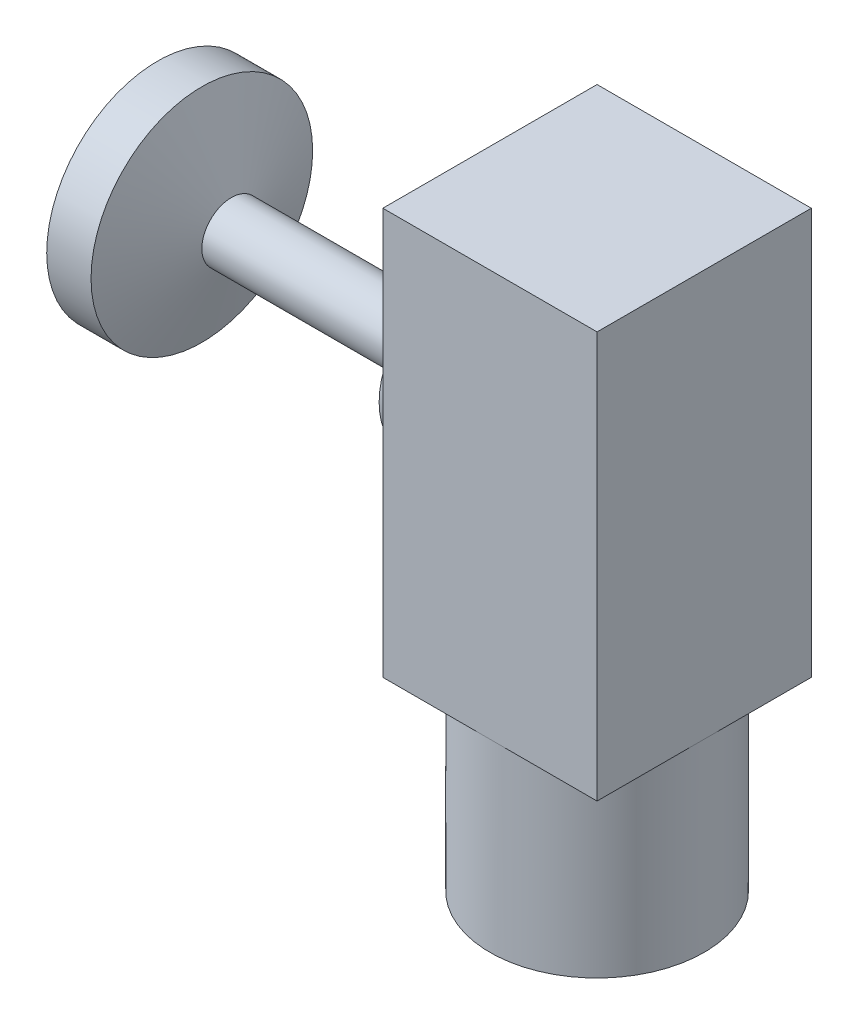
ISO-10303-21;
HEADER;
FILE_DESCRIPTION(('STEP AP214'),'2;1');
FILE_NAME('part.step','',(''),(''),'','','');
FILE_SCHEMA(('AUTOMOTIVE_DESIGN { 1 0 10303 214 1 1 1 1 }'));
ENDSEC;
DATA;
#1=APPLICATION_CONTEXT('core data for automotive mechanical design processes');
#2=APPLICATION_PROTOCOL_DEFINITION('international standard','automotive_design',2000,#1);
#3=PRODUCT_CONTEXT('',#1,'mechanical');
#4=PRODUCT('Part','Part','',(#3));
#5=PRODUCT_RELATED_PRODUCT_CATEGORY('part','',(#4));
#6=PRODUCT_DEFINITION_FORMATION('','',#4);
#7=PRODUCT_DEFINITION_CONTEXT('part definition',#1,'design');
#8=PRODUCT_DEFINITION('design','',#6,#7);
#9=PRODUCT_DEFINITION_SHAPE('','',#8);
#10=(LENGTH_UNIT() NAMED_UNIT(*) SI_UNIT(.MILLI.,.METRE.));
#11=(NAMED_UNIT(*) PLANE_ANGLE_UNIT() SI_UNIT($,.RADIAN.));
#12=(NAMED_UNIT(*) SI_UNIT($,.STERADIAN.) SOLID_ANGLE_UNIT());
#13=UNCERTAINTY_MEASURE_WITH_UNIT(LENGTH_MEASURE(1.E-05),#10,'distance_accuracy_value','');
#14=(GEOMETRIC_REPRESENTATION_CONTEXT(3) GLOBAL_UNCERTAINTY_ASSIGNED_CONTEXT((#13)) GLOBAL_UNIT_ASSIGNED_CONTEXT((#10,
#11,#12)) REPRESENTATION_CONTEXT('',''));
#15=CARTESIAN_POINT('',(0.,0.,0.));
#16=DIRECTION('',(0.,0.,1.));
#17=DIRECTION('',(1.,0.,0.));
#18=AXIS2_PLACEMENT_3D('',#15,#16,#17);
#19=CARTESIAN_POINT('',(64.,-27.5,14.5));
#20=DIRECTION('',(0.,1.,0.));
#21=DIRECTION('',(0.,0.,1.));
#22=AXIS2_PLACEMENT_3D('',#19,#20,#21);
#23=PLANE('',#22);
#24=CARTESIAN_POINT('',(49.5,-27.5,0.));
#25=DIRECTION('',(0.,-1.,0.));
#26=DIRECTION('',(0.,0.,-1.));
#27=AXIS2_PLACEMENT_3D('',#24,#25,#26);
#28=CIRCLE('',#27,14.5);
#29=CARTESIAN_POINT('',(49.5,-27.5,-14.5));
#30=VERTEX_POINT('',#29);
#31=CARTESIAN_POINT('',(64.,-27.5,0.));
#32=VERTEX_POINT('',#31);
#33=EDGE_CURVE('E52',#30,#32,#28,.T.);
#34=ORIENTED_EDGE('',*,*,#33,.F.);
#35=DIRECTION('',(-1.,0.,0.));
#36=VECTOR('',#35,1.);
#37=CARTESIAN_POINT('',(64.,-27.5,-14.5));
#38=LINE('',#37,#36);
#39=CARTESIAN_POINT('',(64.,-27.5,-14.5));
#40=VERTEX_POINT('',#39);
#41=EDGE_CURVE('E97',#40,#30,#38,.T.);
#42=ORIENTED_EDGE('',*,*,#41,.F.);
#43=DIRECTION('',(0.,0.,-1.));
#44=VECTOR('',#43,1.);
#45=CARTESIAN_POINT('',(64.,-27.5,14.5));
#46=LINE('',#45,#44);
#47=EDGE_CURVE('E119',#32,#40,#46,.T.);
#48=ORIENTED_EDGE('',*,*,#47,.F.);
#49=EDGE_LOOP('',(#34,#42,#48));
#50=FACE_BOUND('',#49,.T.);
#51=ADVANCED_FACE('F41',(#50),#23,.F.);
#52=CARTESIAN_POINT('',(49.5,-27.5,14.5));
#53=VERTEX_POINT('',#52);
#54=EDGE_CURVE('E11',#32,#53,#28,.T.);
#55=ORIENTED_EDGE('',*,*,#54,.F.);
#56=CARTESIAN_POINT('',(64.,-27.5,14.5));
#57=VERTEX_POINT('',#56);
#58=EDGE_CURVE('E117',#57,#32,#46,.T.);
#59=ORIENTED_EDGE('',*,*,#58,.F.);
#60=DIRECTION('',(-1.,0.,0.));
#61=VECTOR('',#60,1.);
#62=CARTESIAN_POINT('',(64.,-27.5,14.5));
#63=LINE('',#62,#61);
#64=EDGE_CURVE('E143',#57,#53,#63,.T.);
#65=ORIENTED_EDGE('',*,*,#64,.T.);
#66=EDGE_LOOP('',(#55,#59,#65));
#67=FACE_BOUND('',#66,.T.);
#68=ADVANCED_FACE('F203',(#67),#23,.F.);
#69=CARTESIAN_POINT('',(35.,-27.5,0.));
#70=VERTEX_POINT('',#69);
#71=EDGE_CURVE('E50',#53,#70,#28,.T.);
#72=ORIENTED_EDGE('',*,*,#71,.F.);
#73=CARTESIAN_POINT('',(35.,-27.5,14.5));
#74=VERTEX_POINT('',#73);
#75=EDGE_CURVE('E108',#53,#74,#63,.T.);
#76=ORIENTED_EDGE('',*,*,#75,.T.);
#77=DIRECTION('',(0.,0.,-1.));
#78=VECTOR('',#77,1.);
#79=CARTESIAN_POINT('',(35.,-27.5,14.5));
#80=LINE('',#79,#78);
#81=EDGE_CURVE('E130',#74,#70,#80,.T.);
#82=ORIENTED_EDGE('',*,*,#81,.T.);
#83=EDGE_LOOP('',(#72,#76,#82));
#84=FACE_BOUND('',#83,.T.);
#85=ADVANCED_FACE('F174',(#84),#23,.F.);
#86=CARTESIAN_POINT('',(-10.,0.,0.));
#87=DIRECTION('',(-1.,0.,0.));
#88=DIRECTION('',(0.,0.,1.));
#89=AXIS2_PLACEMENT_3D('',#86,#87,#88);
#90=CYLINDRICAL_SURFACE('',#89,4.);
#91=CARTESIAN_POINT('',(0.,0.,0.));
#92=DIRECTION('',(-1.,0.,0.));
#93=DIRECTION('',(0.,0.,1.));
#94=AXIS2_PLACEMENT_3D('',#91,#92,#93);
#95=CIRCLE('',#94,4.);
#96=CARTESIAN_POINT('',(0.,0.,4.));
#97=VERTEX_POINT('',#96);
#98=EDGE_CURVE('E45',#97,#97,#95,.T.);
#99=ORIENTED_EDGE('',*,*,#98,.F.);
#100=EDGE_LOOP('',(#99));
#101=FACE_BOUND('',#100,.T.);
#102=CARTESIAN_POINT('',(30.,0.,0.));
#103=DIRECTION('',(-1.,0.,0.));
#104=DIRECTION('',(0.,0.,1.));
#105=AXIS2_PLACEMENT_3D('',#102,#103,#104);
#106=CIRCLE('',#105,4.);
#107=CARTESIAN_POINT('',(30.,0.,4.));
#108=VERTEX_POINT('',#107);
#109=EDGE_CURVE('E152',#108,#108,#106,.T.);
#110=ORIENTED_EDGE('',*,*,#109,.T.);
#111=EDGE_LOOP('',(#110));
#112=FACE_BOUND('',#111,.T.);
#113=ADVANCED_FACE('F43',(#101,#112),#90,.T.);
#114=CARTESIAN_POINT('',(0.,0.,0.));
#115=DIRECTION('',(-1.,0.,0.));
#116=DIRECTION('',(0.,0.,1.));
#117=AXIS2_PLACEMENT_3D('',#114,#115,#116);
#118=CONICAL_SURFACE('',#117,4.,1.22202532321099);
#119=CARTESIAN_POINT('',(-4.,0.,0.));
#120=DIRECTION('',(-1.,0.,0.));
#121=DIRECTION('',(0.,0.,1.));
#122=AXIS2_PLACEMENT_3D('',#119,#120,#121);
#123=CIRCLE('',#122,15.);
#124=CARTESIAN_POINT('',(-4.,0.,15.));
#125=VERTEX_POINT('',#124);
#126=EDGE_CURVE('E125',#125,#125,#123,.T.);
#127=CARTESIAN_POINT('',(-4.,0.,15.));
#128=CARTESIAN_POINT('',(-3.95833333333334,0.,14.8854166666667));
#129=CARTESIAN_POINT('',(-3.91666666666667,0.,14.7708333333333));
#130=CARTESIAN_POINT('',(-3.83333333333333,0.,14.5416666666667));
#131=CARTESIAN_POINT('',(-3.79166666666667,0.,14.4270833333333));
#132=CARTESIAN_POINT('',(-3.70833333333333,0.,14.1979166666667));
#133=CARTESIAN_POINT('',(-3.66666666666667,0.,14.0833333333333));
#134=CARTESIAN_POINT('',(-3.58333333333334,0.,13.8541666666667));
#135=CARTESIAN_POINT('',(-3.54166666666667,0.,13.7395833333333));
#136=CARTESIAN_POINT('',(-3.45833333333333,0.,13.5104166666667));
#137=CARTESIAN_POINT('',(-3.41666666666667,0.,13.3958333333333));
#138=CARTESIAN_POINT('',(-3.33333333333333,0.,13.1666666666667));
#139=CARTESIAN_POINT('',(-3.29166666666667,0.,13.0520833333333));
#140=CARTESIAN_POINT('',(-3.20833333333334,0.,12.8229166666667));
#141=CARTESIAN_POINT('',(-3.16666666666667,0.,12.7083333333333));
#142=CARTESIAN_POINT('',(-3.08333333333333,0.,12.4791666666667));
#143=CARTESIAN_POINT('',(-3.04166666666667,0.,12.3645833333333));
#144=CARTESIAN_POINT('',(-2.95833333333333,0.,12.1354166666667));
#145=CARTESIAN_POINT('',(-2.91666666666667,0.,12.0208333333333));
#146=CARTESIAN_POINT('',(-2.83333333333333,0.,11.7916666666667));
#147=CARTESIAN_POINT('',(-2.79166666666667,0.,11.6770833333333));
#148=CARTESIAN_POINT('',(-2.70833333333333,0.,11.4479166666667));
#149=CARTESIAN_POINT('',(-2.66666666666667,0.,11.3333333333333));
#150=CARTESIAN_POINT('',(-2.58333333333334,0.,11.1041666666667));
#151=CARTESIAN_POINT('',(-2.54166666666667,0.,10.9895833333333));
#152=CARTESIAN_POINT('',(-2.45833333333333,0.,10.7604166666667));
#153=CARTESIAN_POINT('',(-2.41666666666667,0.,10.6458333333333));
#154=CARTESIAN_POINT('',(-2.33333333333333,0.,10.4166666666667));
#155=CARTESIAN_POINT('',(-2.29166666666667,0.,10.3020833333333));
#156=CARTESIAN_POINT('',(-2.20833333333333,0.,10.0729166666667));
#157=CARTESIAN_POINT('',(-2.16666666666667,0.,9.95833333333333));
#158=CARTESIAN_POINT('',(-2.08333333333333,0.,9.72916666666667));
#159=CARTESIAN_POINT('',(-2.04166666666667,0.,9.61458333333333));
#160=CARTESIAN_POINT('',(-1.95833333333333,0.,9.38541666666667));
#161=CARTESIAN_POINT('',(-1.91666666666667,0.,9.27083333333333));
#162=CARTESIAN_POINT('',(-1.83333333333333,0.,9.04166666666667));
#163=CARTESIAN_POINT('',(-1.79166666666667,0.,8.92708333333333));
#164=CARTESIAN_POINT('',(-1.70833333333333,0.,8.69791666666667));
#165=CARTESIAN_POINT('',(-1.66666666666667,0.,8.58333333333333));
#166=CARTESIAN_POINT('',(-1.58333333333333,0.,8.35416666666667));
#167=CARTESIAN_POINT('',(-1.54166666666667,0.,8.23958333333333));
#168=CARTESIAN_POINT('',(-1.45833333333333,0.,8.01041666666667));
#169=CARTESIAN_POINT('',(-1.41666666666667,0.,7.89583333333333));
#170=CARTESIAN_POINT('',(-1.33333333333333,0.,7.66666666666667));
#171=CARTESIAN_POINT('',(-1.29166666666667,0.,7.55208333333333));
#172=CARTESIAN_POINT('',(-1.20833333333333,0.,7.32291666666667));
#173=CARTESIAN_POINT('',(-1.16666666666667,0.,7.20833333333333));
#174=CARTESIAN_POINT('',(-1.08333333333333,0.,6.97916666666667));
#175=CARTESIAN_POINT('',(-1.04166666666667,0.,6.86458333333333));
#176=CARTESIAN_POINT('',(-0.958333333333334,0.,6.63541666666667));
#177=CARTESIAN_POINT('',(-0.916666666666667,0.,6.52083333333333));
#178=CARTESIAN_POINT('',(-0.833333333333334,0.,6.29166666666667));
#179=CARTESIAN_POINT('',(-0.791666666666667,0.,6.17708333333333));
#180=CARTESIAN_POINT('',(-0.708333333333333,0.,5.94791666666667));
#181=CARTESIAN_POINT('',(-0.666666666666667,0.,5.83333333333333));
#182=CARTESIAN_POINT('',(-0.583333333333334,0.,5.60416666666667));
#183=CARTESIAN_POINT('',(-0.541666666666667,0.,5.48958333333333));
#184=CARTESIAN_POINT('',(-0.458333333333334,0.,5.26041666666667));
#185=CARTESIAN_POINT('',(-0.416666666666667,0.,5.14583333333333));
#186=CARTESIAN_POINT('',(-0.333333333333334,0.,4.91666666666667));
#187=CARTESIAN_POINT('',(-0.291666666666667,0.,4.80208333333333));
#188=CARTESIAN_POINT('',(-0.208333333333334,0.,4.57291666666667));
#189=CARTESIAN_POINT('',(-0.166666666666667,0.,4.45833333333333));
#190=CARTESIAN_POINT('',(-0.0833333333333334,0.,4.22916666666667));
#191=CARTESIAN_POINT('',(-0.0416666666666667,0.,4.11458333333333));
#192=CARTESIAN_POINT('',(0.,0.,4.));
#193=B_SPLINE_CURVE_WITH_KNOTS('',3,(#127,#128,#129,#130,#131,#132,#133,#134,#135,#136,#137,
#138,#139,#140,#141,#142,#143,#144,#145,#146,#147,#148,#149,#150,#151,#152,#153,#154,#155,#156,
#157,#158,#159,#160,#161,#162,#163,#164,#165,#166,#167,#168,#169,#170,#171,#172,#173,#174,#175,
#176,#177,#178,#179,#180,#181,#182,#183,#184,#185,#186,#187,#188,#189,#190,#191,#192),
.UNSPECIFIED.,.F.,.F.,(4,2,2,2,2,2,2,2,2,2,2,2,2,2,2,2,2,2,2,2,2,2,2,2,2,2,2,2,2,2,2,2,4),(0.,
0.365771872209989,0.731543744419977,1.09731561662997,1.46308748883995,1.82885936104994,
2.19463123325993,2.56040310546992,2.92617497767991,3.29194684988989,3.65771872209988,
4.02349059430987,4.38926246651986,4.75503433872985,5.12080621093984,5.48657808314982,
5.85234995535981,6.2181218275698,6.58389369977979,6.94966557198978,7.31543744419976,
7.68120931640975,8.04698118861974,8.41275306082973,8.77852493303972,9.14429680524971,
9.51006867745969,9.87584054966968,10.2416124218797,10.6073842940897,10.9731561662996,
11.3389280385096,11.7046999107196),.UNSPECIFIED.);
#194=EDGE_CURVE('BSEAM167',#125,#97,#193,.T.);
#195=ORIENTED_EDGE('',*,*,#126,.F.);
#196=ORIENTED_EDGE('',*,*,#98,.T.);
#197=ORIENTED_EDGE('',*,*,#194,.T.);
#198=ORIENTED_EDGE('',*,*,#194,.F.);
#199=EDGE_LOOP('',(#195,#197,#196,#198));
#200=FACE_BOUND('',#199,.T.);
#201=ADVANCED_FACE('F167',(#200),#118,.T.);
#202=CARTESIAN_POINT('',(-10.,0.,0.));
#203=DIRECTION('',(-1.,0.,0.));
#204=DIRECTION('',(0.,0.,1.));
#205=AXIS2_PLACEMENT_3D('',#202,#203,#204);
#206=CYLINDRICAL_SURFACE('',#205,15.);
#207=CARTESIAN_POINT('',(-10.,0.,0.));
#208=DIRECTION('',(-1.,0.,0.));
#209=DIRECTION('',(0.,0.,1.));
#210=AXIS2_PLACEMENT_3D('',#207,#208,#209);
#211=CIRCLE('',#210,15.);
#212=CARTESIAN_POINT('',(-10.,0.,15.));
#213=VERTEX_POINT('',#212);
#214=EDGE_CURVE('E158',#213,#213,#211,.T.);
#215=ORIENTED_EDGE('',*,*,#214,.F.);
#216=EDGE_LOOP('',(#215));
#217=FACE_BOUND('',#216,.T.);
#218=ORIENTED_EDGE('',*,*,#126,.T.);
#219=EDGE_LOOP('',(#218));
#220=FACE_BOUND('',#219,.T.);
#221=ADVANCED_FACE('F165',(#217,#220),#206,.T.);
#222=CARTESIAN_POINT('',(-10.,15.,0.));
#223=DIRECTION('',(1.,0.,0.));
#224=DIRECTION('',(0.,0.,-1.));
#225=AXIS2_PLACEMENT_3D('',#222,#223,#224);
#226=PLANE('',#225);
#227=ORIENTED_EDGE('',*,*,#214,.T.);
#228=EDGE_LOOP('',(#227));
#229=FACE_BOUND('',#228,.T.);
#230=ADVANCED_FACE('F186',(#229),#226,.F.);
#231=CARTESIAN_POINT('',(-10.,0.,0.));
#232=DIRECTION('',(-1.,0.,0.));
#233=DIRECTION('',(0.,0.,1.));
#234=AXIS2_PLACEMENT_3D('',#231,#232,#233);
#235=CYLINDRICAL_SURFACE('',#234,10.);
#236=CARTESIAN_POINT('',(30.,0.,0.));
#237=DIRECTION('',(-1.,0.,0.));
#238=DIRECTION('',(0.,0.,1.));
#239=AXIS2_PLACEMENT_3D('',#236,#237,#238);
#240=CIRCLE('',#239,10.);
#241=CARTESIAN_POINT('',(30.,0.,10.));
#242=VERTEX_POINT('',#241);
#243=EDGE_CURVE('E155',#242,#242,#240,.T.);
#244=ORIENTED_EDGE('',*,*,#243,.F.);
#245=EDGE_LOOP('',(#244));
#246=FACE_BOUND('',#245,.T.);
#247=CARTESIAN_POINT('',(35.,0.,0.));
#248=DIRECTION('',(-1.,0.,0.));
#249=DIRECTION('',(0.,0.,1.));
#250=AXIS2_PLACEMENT_3D('',#247,#248,#249);
#251=CIRCLE('',#250,10.);
#252=CARTESIAN_POINT('',(35.,0.,10.));
#253=VERTEX_POINT('',#252);
#254=EDGE_CURVE('E151',#253,#253,#251,.T.);
#255=ORIENTED_EDGE('',*,*,#254,.T.);
#256=EDGE_LOOP('',(#255));
#257=FACE_BOUND('',#256,.T.);
#258=ADVANCED_FACE('F180',(#246,#257),#235,.T.);
#259=CARTESIAN_POINT('',(30.,4.,0.));
#260=DIRECTION('',(1.,0.,0.));
#261=DIRECTION('',(0.,0.,-1.));
#262=AXIS2_PLACEMENT_3D('',#259,#260,#261);
#263=PLANE('',#262);
#264=ORIENTED_EDGE('',*,*,#109,.F.);
#265=EDGE_LOOP('',(#264));
#266=FACE_BOUND('',#265,.T.);
#267=ORIENTED_EDGE('',*,*,#243,.T.);
#268=EDGE_LOOP('',(#267));
#269=FACE_BOUND('',#268,.T.);
#270=ADVANCED_FACE('F177',(#266,#269),#263,.F.);
#271=CARTESIAN_POINT('',(64.,-27.5,-14.5));
#272=DIRECTION('',(0.,0.,1.));
#273=DIRECTION('',(1.,0.,0.));
#274=AXIS2_PLACEMENT_3D('',#271,#272,#273);
#275=PLANE('',#274);
#276=DIRECTION('',(0.,1.,0.));
#277=VECTOR('',#276,1.);
#278=CARTESIAN_POINT('',(35.,-27.5,-14.5));
#279=LINE('',#278,#277);
#280=CARTESIAN_POINT('',(35.,-27.5,-14.5));
#281=VERTEX_POINT('',#280);
#282=CARTESIAN_POINT('',(35.,27.5,-14.5));
#283=VERTEX_POINT('',#282);
#284=EDGE_CURVE('E135',#281,#283,#279,.T.);
#285=ORIENTED_EDGE('',*,*,#284,.T.);
#286=DIRECTION('',(-1.,0.,0.));
#287=VECTOR('',#286,1.);
#288=CARTESIAN_POINT('',(64.,27.5,-14.5));
#289=LINE('',#288,#287);
#290=CARTESIAN_POINT('',(64.,27.5,-14.5));
#291=VERTEX_POINT('',#290);
#292=EDGE_CURVE('E148',#291,#283,#289,.T.);
#293=ORIENTED_EDGE('',*,*,#292,.F.);
#294=DIRECTION('',(0.,1.,0.));
#295=VECTOR('',#294,1.);
#296=CARTESIAN_POINT('',(64.,-27.5,-14.5));
#297=LINE('',#296,#295);
#298=EDGE_CURVE('E105',#40,#291,#297,.T.);
#299=ORIENTED_EDGE('',*,*,#298,.F.);
#300=ORIENTED_EDGE('',*,*,#41,.T.);
#301=EDGE_CURVE('E101',#30,#281,#38,.T.);
#302=ORIENTED_EDGE('',*,*,#301,.T.);
#303=EDGE_LOOP('',(#285,#293,#299,#300,#302));
#304=FACE_BOUND('',#303,.T.);
#305=ADVANCED_FACE('F100',(#304),#275,.F.);
#306=CARTESIAN_POINT('',(64.,27.5,14.5));
#307=DIRECTION('',(0.,-1.,0.));
#308=DIRECTION('',(0.,0.,-1.));
#309=AXIS2_PLACEMENT_3D('',#306,#307,#308);
#310=PLANE('',#309);
#311=DIRECTION('',(0.,0.,1.));
#312=VECTOR('',#311,1.);
#313=CARTESIAN_POINT('',(35.,27.5,14.5));
#314=LINE('',#313,#312);
#315=CARTESIAN_POINT('',(35.,27.5,14.5));
#316=VERTEX_POINT('',#315);
#317=EDGE_CURVE('E137',#283,#316,#314,.T.);
#318=ORIENTED_EDGE('',*,*,#317,.T.);
#319=DIRECTION('',(-1.,0.,0.));
#320=VECTOR('',#319,1.);
#321=CARTESIAN_POINT('',(64.,27.5,14.5));
#322=LINE('',#321,#320);
#323=CARTESIAN_POINT('',(64.,27.5,14.5));
#324=VERTEX_POINT('',#323);
#325=EDGE_CURVE('E145',#324,#316,#322,.T.);
#326=ORIENTED_EDGE('',*,*,#325,.F.);
#327=DIRECTION('',(0.,0.,1.));
#328=VECTOR('',#327,1.);
#329=CARTESIAN_POINT('',(64.,27.5,14.5));
#330=LINE('',#329,#328);
#331=EDGE_CURVE('E129',#291,#324,#330,.T.);
#332=ORIENTED_EDGE('',*,*,#331,.F.);
#333=ORIENTED_EDGE('',*,*,#292,.T.);
#334=EDGE_LOOP('',(#318,#326,#332,#333));
#335=FACE_BOUND('',#334,.T.);
#336=ADVANCED_FACE('F198',(#335),#310,.F.);
#337=CARTESIAN_POINT('',(64.,-27.5,14.5));
#338=DIRECTION('',(0.,0.,-1.));
#339=DIRECTION('',(-1.,0.,0.));
#340=AXIS2_PLACEMENT_3D('',#337,#338,#339);
#341=PLANE('',#340);
#342=DIRECTION('',(0.,-1.,0.));
#343=VECTOR('',#342,1.);
#344=CARTESIAN_POINT('',(35.,-27.5,14.5));
#345=LINE('',#344,#343);
#346=EDGE_CURVE('E139',#316,#74,#345,.T.);
#347=ORIENTED_EDGE('',*,*,#346,.T.);
#348=ORIENTED_EDGE('',*,*,#75,.F.);
#349=ORIENTED_EDGE('',*,*,#64,.F.);
#350=DIRECTION('',(0.,-1.,0.));
#351=VECTOR('',#350,1.);
#352=CARTESIAN_POINT('',(64.,-27.5,14.5));
#353=LINE('',#352,#351);
#354=EDGE_CURVE('E132',#324,#57,#353,.T.);
#355=ORIENTED_EDGE('',*,*,#354,.F.);
#356=ORIENTED_EDGE('',*,*,#325,.T.);
#357=EDGE_LOOP('',(#347,#348,#349,#355,#356));
#358=FACE_BOUND('',#357,.T.);
#359=ADVANCED_FACE('F205',(#358),#341,.F.);
#360=EDGE_CURVE('E113',#70,#30,#28,.T.);
#361=ORIENTED_EDGE('',*,*,#360,.F.);
#362=EDGE_CURVE('E115',#70,#281,#80,.T.);
#363=ORIENTED_EDGE('',*,*,#362,.T.);
#364=ORIENTED_EDGE('',*,*,#301,.F.);
#365=EDGE_LOOP('',(#361,#363,#364));
#366=FACE_BOUND('',#365,.T.);
#367=ADVANCED_FACE('F111',(#366),#23,.F.);
#368=CARTESIAN_POINT('',(64.,0.,0.));
#369=DIRECTION('',(-1.,0.,0.));
#370=DIRECTION('',(0.,0.,1.));
#371=AXIS2_PLACEMENT_3D('',#368,#369,#370);
#372=PLANE('',#371);
#373=ORIENTED_EDGE('',*,*,#298,.T.);
#374=ORIENTED_EDGE('',*,*,#331,.T.);
#375=ORIENTED_EDGE('',*,*,#354,.T.);
#376=ORIENTED_EDGE('',*,*,#58,.T.);
#377=ORIENTED_EDGE('',*,*,#47,.T.);
#378=EDGE_LOOP('',(#373,#374,#375,#376,#377));
#379=FACE_BOUND('',#378,.T.);
#380=ADVANCED_FACE('F193',(#379),#372,.F.);
#381=CARTESIAN_POINT('',(35.,0.,0.));
#382=DIRECTION('',(-1.,0.,0.));
#383=DIRECTION('',(0.,0.,1.));
#384=AXIS2_PLACEMENT_3D('',#381,#382,#383);
#385=PLANE('',#384);
#386=ORIENTED_EDGE('',*,*,#254,.F.);
#387=EDGE_LOOP('',(#386));
#388=FACE_BOUND('',#387,.T.);
#389=ORIENTED_EDGE('',*,*,#284,.F.);
#390=ORIENTED_EDGE('',*,*,#362,.F.);
#391=ORIENTED_EDGE('',*,*,#81,.F.);
#392=ORIENTED_EDGE('',*,*,#346,.F.);
#393=ORIENTED_EDGE('',*,*,#317,.F.);
#394=EDGE_LOOP('',(#389,#390,#391,#392,#393));
#395=FACE_BOUND('',#394,.T.);
#396=ADVANCED_FACE('F190',(#388,#395),#385,.T.);
#397=CARTESIAN_POINT('',(49.5,-52.5,0.));
#398=DIRECTION('',(0.,1.,0.));
#399=DIRECTION('',(0.,0.,1.));
#400=AXIS2_PLACEMENT_3D('',#397,#398,#399);
#401=CYLINDRICAL_SURFACE('',#400,14.5);
#402=CARTESIAN_POINT('',(49.5,-52.5,0.));
#403=DIRECTION('',(0.,-1.,0.));
#404=DIRECTION('',(0.,0.,-1.));
#405=AXIS2_PLACEMENT_3D('',#402,#403,#404);
#406=CIRCLE('',#405,14.5);
#407=CARTESIAN_POINT('',(49.5,-52.5,-14.5));
#408=VERTEX_POINT('',#407);
#409=EDGE_CURVE('E122',#408,#408,#406,.T.);
#410=ORIENTED_EDGE('',*,*,#409,.F.);
#411=EDGE_LOOP('',(#410));
#412=FACE_BOUND('',#411,.T.);
#413=ORIENTED_EDGE('',*,*,#33,.T.);
#414=ORIENTED_EDGE('',*,*,#54,.T.);
#415=ORIENTED_EDGE('',*,*,#71,.T.);
#416=ORIENTED_EDGE('',*,*,#360,.T.);
#417=EDGE_LOOP('',(#413,#414,#415,#416));
#418=FACE_BOUND('',#417,.T.);
#419=ADVANCED_FACE('F123',(#412,#418),#401,.T.);
#420=CARTESIAN_POINT('',(49.5,-52.5,0.));
#421=DIRECTION('',(0.,-1.,0.));
#422=DIRECTION('',(0.,0.,-1.));
#423=AXIS2_PLACEMENT_3D('',#420,#421,#422);
#424=PLANE('',#423);
#425=ORIENTED_EDGE('',*,*,#409,.T.);
#426=EDGE_LOOP('',(#425));
#427=FACE_BOUND('',#426,.T.);
#428=ADVANCED_FACE('F240',(#427),#424,.T.);
#429=CLOSED_SHELL('',(#51,#68,#85,#113,#201,#221,#230,#258,#270,#305,#336,#359,#367,#380,#396,
#419,#428));
#430=MANIFOLD_SOLID_BREP('B2',#429);
#431=ADVANCED_BREP_SHAPE_REPRESENTATION('',(#18,#430),#14);
#432=SHAPE_DEFINITION_REPRESENTATION(#9,#431);
ENDSEC;
END-ISO-10303-21;
